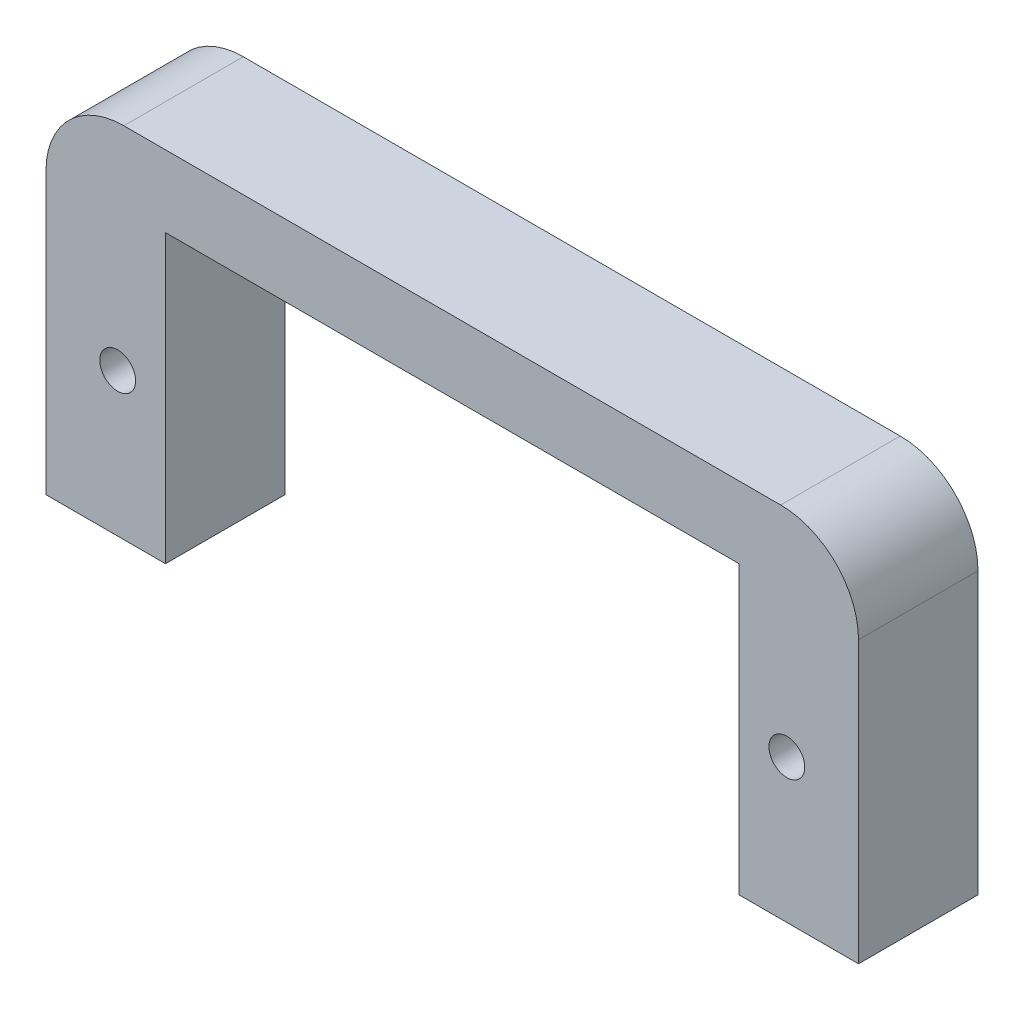
ISO-10303-21;
HEADER;
FILE_DESCRIPTION(('STEP AP214'),'2;1');
FILE_NAME('part.step','',(''),(''),'','','');
FILE_SCHEMA(('AUTOMOTIVE_DESIGN { 1 0 10303 214 1 1 1 1 }'));
ENDSEC;
DATA;
#1=APPLICATION_CONTEXT('core data for automotive mechanical design processes');
#2=APPLICATION_PROTOCOL_DEFINITION('international standard','automotive_design',2000,#1);
#3=PRODUCT_CONTEXT('',#1,'mechanical');
#4=PRODUCT('Part','Part','',(#3));
#5=PRODUCT_RELATED_PRODUCT_CATEGORY('part','',(#4));
#6=PRODUCT_DEFINITION_FORMATION('','',#4);
#7=PRODUCT_DEFINITION_CONTEXT('part definition',#1,'design');
#8=PRODUCT_DEFINITION('design','',#6,#7);
#9=PRODUCT_DEFINITION_SHAPE('','',#8);
#10=(LENGTH_UNIT() NAMED_UNIT(*) SI_UNIT(.MILLI.,.METRE.));
#11=(NAMED_UNIT(*) PLANE_ANGLE_UNIT() SI_UNIT($,.RADIAN.));
#12=(NAMED_UNIT(*) SI_UNIT($,.STERADIAN.) SOLID_ANGLE_UNIT());
#13=UNCERTAINTY_MEASURE_WITH_UNIT(LENGTH_MEASURE(1.E-05),#10,'distance_accuracy_value','');
#14=(GEOMETRIC_REPRESENTATION_CONTEXT(3) GLOBAL_UNCERTAINTY_ASSIGNED_CONTEXT((#13)) GLOBAL_UNIT_ASSIGNED_CONTEXT((#10,
#11,#12)) REPRESENTATION_CONTEXT('',''));
#15=CARTESIAN_POINT('',(0.,0.,0.));
#16=DIRECTION('',(0.,0.,1.));
#17=DIRECTION('',(1.,0.,0.));
#18=AXIS2_PLACEMENT_3D('',#15,#16,#17);
#19=CARTESIAN_POINT('',(13.7445176797263,5.7445176797263,2.5));
#20=DIRECTION('',(0.,0.,1.));
#21=DIRECTION('',(1.,0.,0.));
#22=AXIS2_PLACEMENT_3D('',#19,#20,#21);
#23=PLANE('',#22);
#24=CARTESIAN_POINT('',(-14.,0.,2.5));
#25=DIRECTION('',(0.,0.,1.));
#26=DIRECTION('',(1.,0.,0.));
#27=AXIS2_PLACEMENT_3D('',#24,#25,#26);
#28=CIRCLE('',#27,0.75);
#29=CARTESIAN_POINT('',(-13.25,0.,2.5));
#30=VERTEX_POINT('',#29);
#31=EDGE_CURVE('E152',#30,#30,#28,.T.);
#32=ORIENTED_EDGE('',*,*,#31,.F.);
#33=EDGE_LOOP('',(#32));
#34=FACE_BOUND('',#33,.T.);
#35=DIRECTION('',(1.,0.,0.));
#36=VECTOR('',#35,1.);
#37=CARTESIAN_POINT('',(12.,-6.,2.5));
#38=LINE('',#37,#36);
#39=CARTESIAN_POINT('',(12.,-6.,2.5));
#40=VERTEX_POINT('',#39);
#41=CARTESIAN_POINT('',(17.,-6.,2.5));
#42=VERTEX_POINT('',#41);
#43=EDGE_CURVE('E167',#40,#42,#38,.T.);
#44=ORIENTED_EDGE('',*,*,#43,.T.);
#45=DIRECTION('',(0.,1.,0.));
#46=VECTOR('',#45,1.);
#47=CARTESIAN_POINT('',(17.,-6.,2.5));
#48=LINE('',#47,#46);
#49=CARTESIAN_POINT('',(17.,5.7445176797263,2.5));
#50=VERTEX_POINT('',#49);
#51=EDGE_CURVE('E105',#42,#50,#48,.T.);
#52=ORIENTED_EDGE('',*,*,#51,.T.);
#53=CARTESIAN_POINT('',(13.7445176797263,5.7445176797263,2.5));
#54=DIRECTION('',(0.,0.,1.));
#55=DIRECTION('',(1.,0.,0.));
#56=AXIS2_PLACEMENT_3D('',#53,#54,#55);
#57=CIRCLE('',#56,3.2554823202737);
#58=CARTESIAN_POINT('',(13.7445176797263,9.,2.5));
#59=VERTEX_POINT('',#58);
#60=EDGE_CURVE('E188',#50,#59,#57,.T.);
#61=ORIENTED_EDGE('',*,*,#60,.T.);
#62=DIRECTION('',(-1.,0.,0.));
#63=VECTOR('',#62,1.);
#64=CARTESIAN_POINT('',(-13.7445176797263,9.,2.5));
#65=LINE('',#64,#63);
#66=CARTESIAN_POINT('',(-13.7445176797263,9.,2.5));
#67=VERTEX_POINT('',#66);
#68=EDGE_CURVE('E207',#59,#67,#65,.T.);
#69=ORIENTED_EDGE('',*,*,#68,.T.);
#70=CARTESIAN_POINT('',(-13.7445176797263,5.7445176797263,2.5));
#71=DIRECTION('',(0.,0.,1.));
#72=DIRECTION('',(-1.,0.,0.));
#73=AXIS2_PLACEMENT_3D('',#70,#71,#72);
#74=CIRCLE('',#73,3.2554823202737);
#75=CARTESIAN_POINT('',(-17.,5.7445176797263,2.5));
#76=VERTEX_POINT('',#75);
#77=EDGE_CURVE('E204',#67,#76,#74,.T.);
#78=ORIENTED_EDGE('',*,*,#77,.T.);
#79=DIRECTION('',(0.,-1.,0.));
#80=VECTOR('',#79,1.);
#81=CARTESIAN_POINT('',(-17.,-6.,2.5));
#82=LINE('',#81,#80);
#83=CARTESIAN_POINT('',(-17.,-6.,2.5));
#84=VERTEX_POINT('',#83);
#85=EDGE_CURVE('E206',#76,#84,#82,.T.);
#86=ORIENTED_EDGE('',*,*,#85,.T.);
#87=DIRECTION('',(1.,0.,0.));
#88=VECTOR('',#87,1.);
#89=CARTESIAN_POINT('',(-12.,-6.,2.5));
#90=LINE('',#89,#88);
#91=CARTESIAN_POINT('',(-12.,-6.,2.5));
#92=VERTEX_POINT('',#91);
#93=EDGE_CURVE('E130',#84,#92,#90,.T.);
#94=ORIENTED_EDGE('',*,*,#93,.T.);
#95=DIRECTION('',(0.,1.,0.));
#96=VECTOR('',#95,1.);
#97=CARTESIAN_POINT('',(-12.,6.,2.5));
#98=LINE('',#97,#96);
#99=CARTESIAN_POINT('',(-12.,6.,2.5));
#100=VERTEX_POINT('',#99);
#101=EDGE_CURVE('E124',#92,#100,#98,.T.);
#102=ORIENTED_EDGE('',*,*,#101,.T.);
#103=DIRECTION('',(1.,0.,0.));
#104=VECTOR('',#103,1.);
#105=CARTESIAN_POINT('',(-12.,6.,2.5));
#106=LINE('',#105,#104);
#107=CARTESIAN_POINT('',(12.,6.,2.5));
#108=VERTEX_POINT('',#107);
#109=EDGE_CURVE('E128',#100,#108,#106,.T.);
#110=ORIENTED_EDGE('',*,*,#109,.T.);
#111=DIRECTION('',(0.,-1.,0.));
#112=VECTOR('',#111,1.);
#113=CARTESIAN_POINT('',(12.,6.,2.5));
#114=LINE('',#113,#112);
#115=EDGE_CURVE('E56',#108,#40,#114,.T.);
#116=ORIENTED_EDGE('',*,*,#115,.T.);
#117=EDGE_LOOP('',(#44,#52,#61,#69,#78,#86,#94,#102,#110,#116));
#118=FACE_BOUND('',#117,.T.);
#119=CARTESIAN_POINT('',(14.,0.,2.5));
#120=DIRECTION('',(0.,0.,1.));
#121=DIRECTION('',(-1.,0.,0.));
#122=AXIS2_PLACEMENT_3D('',#119,#120,#121);
#123=CIRCLE('',#122,0.75);
#124=CARTESIAN_POINT('',(13.25,0.,2.5));
#125=VERTEX_POINT('',#124);
#126=EDGE_CURVE('E218',#125,#125,#123,.T.);
#127=ORIENTED_EDGE('',*,*,#126,.F.);
#128=EDGE_LOOP('',(#127));
#129=FACE_BOUND('',#128,.T.);
#130=ADVANCED_FACE('F39',(#34,#118,#129),#23,.T.);
#131=CARTESIAN_POINT('',(13.7445176797263,5.7445176797263,-2.5));
#132=DIRECTION('',(0.,0.,1.));
#133=DIRECTION('',(1.,0.,0.));
#134=AXIS2_PLACEMENT_3D('',#131,#132,#133);
#135=PLANE('',#134);
#136=DIRECTION('',(1.,0.,0.));
#137=VECTOR('',#136,1.);
#138=CARTESIAN_POINT('',(12.,-6.,-2.5));
#139=LINE('',#138,#137);
#140=CARTESIAN_POINT('',(12.,-6.,-2.5));
#141=VERTEX_POINT('',#140);
#142=CARTESIAN_POINT('',(17.,-6.,-2.5));
#143=VERTEX_POINT('',#142);
#144=EDGE_CURVE('E148',#141,#143,#139,.T.);
#145=ORIENTED_EDGE('',*,*,#144,.F.);
#146=DIRECTION('',(0.,-1.,0.));
#147=VECTOR('',#146,1.);
#148=CARTESIAN_POINT('',(12.,6.,-2.5));
#149=LINE('',#148,#147);
#150=CARTESIAN_POINT('',(12.,6.,-2.5));
#151=VERTEX_POINT('',#150);
#152=EDGE_CURVE('E97',#151,#141,#149,.T.);
#153=ORIENTED_EDGE('',*,*,#152,.F.);
#154=DIRECTION('',(1.,0.,0.));
#155=VECTOR('',#154,1.);
#156=CARTESIAN_POINT('',(-12.,6.,-2.5));
#157=LINE('',#156,#155);
#158=CARTESIAN_POINT('',(-12.,6.,-2.5));
#159=VERTEX_POINT('',#158);
#160=EDGE_CURVE('E91',#159,#151,#157,.T.);
#161=ORIENTED_EDGE('',*,*,#160,.F.);
#162=DIRECTION('',(0.,1.,0.));
#163=VECTOR('',#162,1.);
#164=CARTESIAN_POINT('',(-12.,6.,-2.5));
#165=LINE('',#164,#163);
#166=CARTESIAN_POINT('',(-12.,-6.,-2.5));
#167=VERTEX_POINT('',#166);
#168=EDGE_CURVE('E138',#167,#159,#165,.T.);
#169=ORIENTED_EDGE('',*,*,#168,.F.);
#170=DIRECTION('',(1.,0.,0.));
#171=VECTOR('',#170,1.);
#172=CARTESIAN_POINT('',(-12.,-6.,-2.5));
#173=LINE('',#172,#171);
#174=CARTESIAN_POINT('',(-17.,-6.,-2.5));
#175=VERTEX_POINT('',#174);
#176=EDGE_CURVE('E162',#175,#167,#173,.T.);
#177=ORIENTED_EDGE('',*,*,#176,.F.);
#178=DIRECTION('',(0.,-1.,0.));
#179=VECTOR('',#178,1.);
#180=CARTESIAN_POINT('',(-17.,-6.,-2.5));
#181=LINE('',#180,#179);
#182=CARTESIAN_POINT('',(-17.,5.7445176797263,-2.5));
#183=VERTEX_POINT('',#182);
#184=EDGE_CURVE('E160',#183,#175,#181,.T.);
#185=ORIENTED_EDGE('',*,*,#184,.F.);
#186=CARTESIAN_POINT('',(-13.7445176797263,5.7445176797263,-2.5));
#187=DIRECTION('',(0.,0.,1.));
#188=DIRECTION('',(-1.,0.,0.));
#189=AXIS2_PLACEMENT_3D('',#186,#187,#188);
#190=CIRCLE('',#189,3.2554823202737);
#191=CARTESIAN_POINT('',(-13.7445176797263,9.,-2.5));
#192=VERTEX_POINT('',#191);
#193=EDGE_CURVE('E158',#192,#183,#190,.T.);
#194=ORIENTED_EDGE('',*,*,#193,.F.);
#195=DIRECTION('',(-1.,0.,0.));
#196=VECTOR('',#195,1.);
#197=CARTESIAN_POINT('',(-13.7445176797263,9.,-2.5));
#198=LINE('',#197,#196);
#199=CARTESIAN_POINT('',(13.7445176797263,9.,-2.5));
#200=VERTEX_POINT('',#199);
#201=EDGE_CURVE('E156',#200,#192,#198,.T.);
#202=ORIENTED_EDGE('',*,*,#201,.F.);
#203=CARTESIAN_POINT('',(13.7445176797263,5.7445176797263,-2.5));
#204=DIRECTION('',(0.,0.,1.));
#205=DIRECTION('',(1.,0.,0.));
#206=AXIS2_PLACEMENT_3D('',#203,#204,#205);
#207=CIRCLE('',#206,3.2554823202737);
#208=CARTESIAN_POINT('',(17.,5.7445176797263,-2.5));
#209=VERTEX_POINT('',#208);
#210=EDGE_CURVE('E154',#209,#200,#207,.T.);
#211=ORIENTED_EDGE('',*,*,#210,.F.);
#212=DIRECTION('',(0.,1.,0.));
#213=VECTOR('',#212,1.);
#214=CARTESIAN_POINT('',(17.,-6.,-2.5));
#215=LINE('',#214,#213);
#216=EDGE_CURVE('E151',#143,#209,#215,.T.);
#217=ORIENTED_EDGE('',*,*,#216,.F.);
#218=EDGE_LOOP('',(#145,#153,#161,#169,#177,#185,#194,#202,#211,#217));
#219=FACE_BOUND('',#218,.T.);
#220=CARTESIAN_POINT('',(-14.,0.,-2.5));
#221=DIRECTION('',(0.,0.,1.));
#222=DIRECTION('',(1.,0.,0.));
#223=AXIS2_PLACEMENT_3D('',#220,#221,#222);
#224=CIRCLE('',#223,0.75);
#225=CARTESIAN_POINT('',(-13.25,0.,-2.5));
#226=VERTEX_POINT('',#225);
#227=EDGE_CURVE('E215',#226,#226,#224,.T.);
#228=ORIENTED_EDGE('',*,*,#227,.T.);
#229=EDGE_LOOP('',(#228));
#230=FACE_BOUND('',#229,.T.);
#231=CARTESIAN_POINT('',(14.,0.,-2.5));
#232=DIRECTION('',(0.,0.,1.));
#233=DIRECTION('',(-1.,0.,0.));
#234=AXIS2_PLACEMENT_3D('',#231,#232,#233);
#235=CIRCLE('',#234,0.75);
#236=CARTESIAN_POINT('',(13.25,0.,-2.5));
#237=VERTEX_POINT('',#236);
#238=EDGE_CURVE('E221',#237,#237,#235,.T.);
#239=ORIENTED_EDGE('',*,*,#238,.T.);
#240=EDGE_LOOP('',(#239));
#241=FACE_BOUND('',#240,.T.);
#242=ADVANCED_FACE('F192',(#219,#230,#241),#135,.F.);
#243=CARTESIAN_POINT('',(12.,-6.,2.5));
#244=DIRECTION('',(0.,1.,0.));
#245=DIRECTION('',(0.,0.,1.));
#246=AXIS2_PLACEMENT_3D('',#243,#244,#245);
#247=PLANE('',#246);
#248=ORIENTED_EDGE('',*,*,#144,.T.);
#249=DIRECTION('',(0.,0.,-1.));
#250=VECTOR('',#249,1.);
#251=CARTESIAN_POINT('',(17.,-6.,2.5));
#252=LINE('',#251,#250);
#253=EDGE_CURVE('E11',#42,#143,#252,.T.);
#254=ORIENTED_EDGE('',*,*,#253,.F.);
#255=ORIENTED_EDGE('',*,*,#43,.F.);
#256=DIRECTION('',(0.,0.,-1.));
#257=VECTOR('',#256,1.);
#258=CARTESIAN_POINT('',(12.,-6.,2.5));
#259=LINE('',#258,#257);
#260=EDGE_CURVE('E144',#40,#141,#259,.T.);
#261=ORIENTED_EDGE('',*,*,#260,.T.);
#262=EDGE_LOOP('',(#248,#254,#255,#261));
#263=FACE_BOUND('',#262,.T.);
#264=ADVANCED_FACE('F41',(#263),#247,.F.);
#265=CARTESIAN_POINT('',(17.,-6.,2.5));
#266=DIRECTION('',(-1.,0.,0.));
#267=DIRECTION('',(0.,0.,1.));
#268=AXIS2_PLACEMENT_3D('',#265,#266,#267);
#269=PLANE('',#268);
#270=ORIENTED_EDGE('',*,*,#216,.T.);
#271=DIRECTION('',(0.,0.,-1.));
#272=VECTOR('',#271,1.);
#273=CARTESIAN_POINT('',(17.,5.7445176797263,2.5));
#274=LINE('',#273,#272);
#275=EDGE_CURVE('E48',#50,#209,#274,.T.);
#276=ORIENTED_EDGE('',*,*,#275,.F.);
#277=ORIENTED_EDGE('',*,*,#51,.F.);
#278=ORIENTED_EDGE('',*,*,#253,.T.);
#279=EDGE_LOOP('',(#270,#276,#277,#278));
#280=FACE_BOUND('',#279,.T.);
#281=ADVANCED_FACE('F261',(#280),#269,.F.);
#282=CARTESIAN_POINT('',(13.7445176797263,5.7445176797263,2.5));
#283=DIRECTION('',(0.,0.,-1.));
#284=DIRECTION('',(-1.,0.,0.));
#285=AXIS2_PLACEMENT_3D('',#282,#283,#284);
#286=CYLINDRICAL_SURFACE('',#285,3.2554823202737);
#287=ORIENTED_EDGE('',*,*,#210,.T.);
#288=DIRECTION('',(0.,0.,-1.));
#289=VECTOR('',#288,1.);
#290=CARTESIAN_POINT('',(13.7445176797263,9.,2.5));
#291=LINE('',#290,#289);
#292=EDGE_CURVE('E180',#59,#200,#291,.T.);
#293=ORIENTED_EDGE('',*,*,#292,.F.);
#294=ORIENTED_EDGE('',*,*,#60,.F.);
#295=ORIENTED_EDGE('',*,*,#275,.T.);
#296=EDGE_LOOP('',(#287,#293,#294,#295));
#297=FACE_BOUND('',#296,.T.);
#298=ADVANCED_FACE('F186',(#297),#286,.T.);
#299=CARTESIAN_POINT('',(-13.7445176797263,9.,2.5));
#300=DIRECTION('',(0.,-1.,0.));
#301=DIRECTION('',(0.,0.,-1.));
#302=AXIS2_PLACEMENT_3D('',#299,#300,#301);
#303=PLANE('',#302);
#304=ORIENTED_EDGE('',*,*,#201,.T.);
#305=DIRECTION('',(0.,0.,-1.));
#306=VECTOR('',#305,1.);
#307=CARTESIAN_POINT('',(-13.7445176797263,9.,2.5));
#308=LINE('',#307,#306);
#309=EDGE_CURVE('E177',#67,#192,#308,.T.);
#310=ORIENTED_EDGE('',*,*,#309,.F.);
#311=ORIENTED_EDGE('',*,*,#68,.F.);
#312=ORIENTED_EDGE('',*,*,#292,.T.);
#313=EDGE_LOOP('',(#304,#310,#311,#312));
#314=FACE_BOUND('',#313,.T.);
#315=ADVANCED_FACE('F198',(#314),#303,.F.);
#316=CARTESIAN_POINT('',(-13.7445176797263,5.7445176797263,2.5));
#317=DIRECTION('',(0.,0.,-1.));
#318=DIRECTION('',(-1.,0.,0.));
#319=AXIS2_PLACEMENT_3D('',#316,#317,#318);
#320=CYLINDRICAL_SURFACE('',#319,3.2554823202737);
#321=ORIENTED_EDGE('',*,*,#193,.T.);
#322=DIRECTION('',(0.,0.,-1.));
#323=VECTOR('',#322,1.);
#324=CARTESIAN_POINT('',(-17.,5.7445176797263,2.5));
#325=LINE('',#324,#323);
#326=EDGE_CURVE('E174',#76,#183,#325,.T.);
#327=ORIENTED_EDGE('',*,*,#326,.F.);
#328=ORIENTED_EDGE('',*,*,#77,.F.);
#329=ORIENTED_EDGE('',*,*,#309,.T.);
#330=EDGE_LOOP('',(#321,#327,#328,#329));
#331=FACE_BOUND('',#330,.T.);
#332=ADVANCED_FACE('F202',(#331),#320,.T.);
#333=CARTESIAN_POINT('',(-17.,-6.,2.5));
#334=DIRECTION('',(1.,0.,0.));
#335=DIRECTION('',(0.,0.,-1.));
#336=AXIS2_PLACEMENT_3D('',#333,#334,#335);
#337=PLANE('',#336);
#338=ORIENTED_EDGE('',*,*,#184,.T.);
#339=DIRECTION('',(0.,0.,-1.));
#340=VECTOR('',#339,1.);
#341=CARTESIAN_POINT('',(-17.,-6.,2.5));
#342=LINE('',#341,#340);
#343=EDGE_CURVE('E171',#84,#175,#342,.T.);
#344=ORIENTED_EDGE('',*,*,#343,.F.);
#345=ORIENTED_EDGE('',*,*,#85,.F.);
#346=ORIENTED_EDGE('',*,*,#326,.T.);
#347=EDGE_LOOP('',(#338,#344,#345,#346));
#348=FACE_BOUND('',#347,.T.);
#349=ADVANCED_FACE('F251',(#348),#337,.F.);
#350=CARTESIAN_POINT('',(-12.,-6.,2.5));
#351=DIRECTION('',(0.,1.,0.));
#352=DIRECTION('',(0.,0.,1.));
#353=AXIS2_PLACEMENT_3D('',#350,#351,#352);
#354=PLANE('',#353);
#355=ORIENTED_EDGE('',*,*,#176,.T.);
#356=DIRECTION('',(0.,0.,-1.));
#357=VECTOR('',#356,1.);
#358=CARTESIAN_POINT('',(-12.,-6.,2.5));
#359=LINE('',#358,#357);
#360=EDGE_CURVE('E139',#92,#167,#359,.T.);
#361=ORIENTED_EDGE('',*,*,#360,.F.);
#362=ORIENTED_EDGE('',*,*,#93,.F.);
#363=ORIENTED_EDGE('',*,*,#343,.T.);
#364=EDGE_LOOP('',(#355,#361,#362,#363));
#365=FACE_BOUND('',#364,.T.);
#366=ADVANCED_FACE('F248',(#365),#354,.F.);
#367=CARTESIAN_POINT('',(-12.,6.,2.5));
#368=DIRECTION('',(-1.,0.,0.));
#369=DIRECTION('',(0.,-1.,0.));
#370=AXIS2_PLACEMENT_3D('',#367,#368,#369);
#371=PLANE('',#370);
#372=ORIENTED_EDGE('',*,*,#168,.T.);
#373=DIRECTION('',(0.,0.,-1.));
#374=VECTOR('',#373,1.);
#375=CARTESIAN_POINT('',(-12.,6.,2.5));
#376=LINE('',#375,#374);
#377=EDGE_CURVE('E135',#100,#159,#376,.T.);
#378=ORIENTED_EDGE('',*,*,#377,.F.);
#379=ORIENTED_EDGE('',*,*,#101,.F.);
#380=ORIENTED_EDGE('',*,*,#360,.T.);
#381=EDGE_LOOP('',(#372,#378,#379,#380));
#382=FACE_BOUND('',#381,.T.);
#383=ADVANCED_FACE('F136',(#382),#371,.F.);
#384=CARTESIAN_POINT('',(-12.,6.,2.5));
#385=DIRECTION('',(0.,1.,0.));
#386=DIRECTION('',(0.,0.,1.));
#387=AXIS2_PLACEMENT_3D('',#384,#385,#386);
#388=PLANE('',#387);
#389=ORIENTED_EDGE('',*,*,#160,.T.);
#390=DIRECTION('',(0.,0.,-1.));
#391=VECTOR('',#390,1.);
#392=CARTESIAN_POINT('',(12.,6.,2.5));
#393=LINE('',#392,#391);
#394=EDGE_CURVE('E140',#108,#151,#393,.T.);
#395=ORIENTED_EDGE('',*,*,#394,.F.);
#396=ORIENTED_EDGE('',*,*,#109,.F.);
#397=ORIENTED_EDGE('',*,*,#377,.T.);
#398=EDGE_LOOP('',(#389,#395,#396,#397));
#399=FACE_BOUND('',#398,.T.);
#400=ADVANCED_FACE('F142',(#399),#388,.F.);
#401=CARTESIAN_POINT('',(12.,6.,2.5));
#402=DIRECTION('',(1.,0.,0.));
#403=DIRECTION('',(0.,1.,0.));
#404=AXIS2_PLACEMENT_3D('',#401,#402,#403);
#405=PLANE('',#404);
#406=ORIENTED_EDGE('',*,*,#152,.T.);
#407=ORIENTED_EDGE('',*,*,#260,.F.);
#408=ORIENTED_EDGE('',*,*,#115,.F.);
#409=ORIENTED_EDGE('',*,*,#394,.T.);
#410=EDGE_LOOP('',(#406,#407,#408,#409));
#411=FACE_BOUND('',#410,.T.);
#412=ADVANCED_FACE('F241',(#411),#405,.F.);
#413=CARTESIAN_POINT('',(-14.,0.,2.5));
#414=DIRECTION('',(0.,0.,-1.));
#415=DIRECTION('',(-1.,0.,0.));
#416=AXIS2_PLACEMENT_3D('',#413,#414,#415);
#417=CYLINDRICAL_SURFACE('',#416,0.75);
#418=ORIENTED_EDGE('',*,*,#31,.T.);
#419=EDGE_LOOP('',(#418));
#420=FACE_BOUND('',#419,.T.);
#421=ORIENTED_EDGE('',*,*,#227,.F.);
#422=EDGE_LOOP('',(#421));
#423=FACE_BOUND('',#422,.T.);
#424=ADVANCED_FACE('F238',(#420,#423),#417,.F.);
#425=CARTESIAN_POINT('',(14.,0.,2.5));
#426=DIRECTION('',(0.,0.,-1.));
#427=DIRECTION('',(-1.,0.,0.));
#428=AXIS2_PLACEMENT_3D('',#425,#426,#427);
#429=CYLINDRICAL_SURFACE('',#428,0.75);
#430=ORIENTED_EDGE('',*,*,#126,.T.);
#431=EDGE_LOOP('',(#430));
#432=FACE_BOUND('',#431,.T.);
#433=ORIENTED_EDGE('',*,*,#238,.F.);
#434=EDGE_LOOP('',(#433));
#435=FACE_BOUND('',#434,.T.);
#436=ADVANCED_FACE('F227',(#432,#435),#429,.F.);
#437=CLOSED_SHELL('',(#130,#242,#264,#281,#298,#315,#332,#349,#366,#383,#400,#412,#424,#436));
#438=MANIFOLD_SOLID_BREP('B2',#437);
#439=ADVANCED_BREP_SHAPE_REPRESENTATION('',(#18,#438),#14);
#440=SHAPE_DEFINITION_REPRESENTATION(#9,#439);
ENDSEC;
END-ISO-10303-21;
